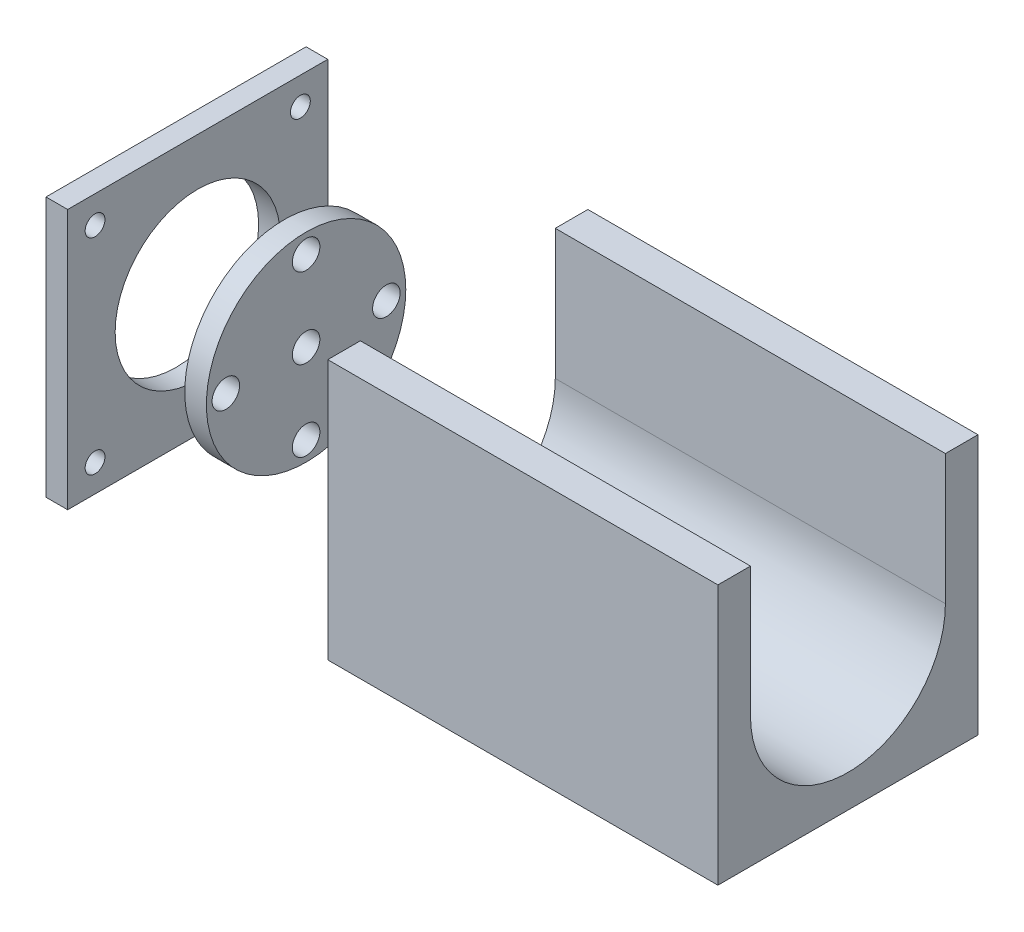
ISO-10303-21;
HEADER;
FILE_DESCRIPTION(('STEP AP214'),'2;1');
FILE_NAME('part.step','',(''),(''),'','','');
FILE_SCHEMA(('AUTOMOTIVE_DESIGN { 1 0 10303 214 1 1 1 1 }'));
ENDSEC;
DATA;
#1=APPLICATION_CONTEXT('core data for automotive mechanical design processes');
#2=APPLICATION_PROTOCOL_DEFINITION('international standard','automotive_design',2000,#1);
#3=PRODUCT_CONTEXT('',#1,'mechanical');
#4=PRODUCT('Part','Part','',(#3));
#5=PRODUCT_RELATED_PRODUCT_CATEGORY('part','',(#4));
#6=PRODUCT_DEFINITION_FORMATION('','',#4);
#7=PRODUCT_DEFINITION_CONTEXT('part definition',#1,'design');
#8=PRODUCT_DEFINITION('design','',#6,#7);
#9=PRODUCT_DEFINITION_SHAPE('','',#8);
#10=(LENGTH_UNIT() NAMED_UNIT(*) SI_UNIT(.MILLI.,.METRE.));
#11=(NAMED_UNIT(*) PLANE_ANGLE_UNIT() SI_UNIT($,.RADIAN.));
#12=(NAMED_UNIT(*) SI_UNIT($,.STERADIAN.) SOLID_ANGLE_UNIT());
#13=UNCERTAINTY_MEASURE_WITH_UNIT(LENGTH_MEASURE(1.E-05),#10,'distance_accuracy_value','');
#14=(GEOMETRIC_REPRESENTATION_CONTEXT(3) GLOBAL_UNCERTAINTY_ASSIGNED_CONTEXT((#13)) GLOBAL_UNIT_ASSIGNED_CONTEXT((#10,
#11,#12)) REPRESENTATION_CONTEXT('',''));
#15=CARTESIAN_POINT('',(0.,0.,0.));
#16=DIRECTION('',(0.,0.,1.));
#17=DIRECTION('',(1.,0.,0.));
#18=AXIS2_PLACEMENT_3D('',#15,#16,#17);
#19=CARTESIAN_POINT('',(155.,0.,0.));
#20=DIRECTION('',(-1.,0.,0.));
#21=DIRECTION('',(0.,0.,1.));
#22=AXIS2_PLACEMENT_3D('',#19,#20,#21);
#23=CYLINDRICAL_SURFACE('',#22,22.48125);
#24=CARTESIAN_POINT('',(65.,0.,0.));
#25=DIRECTION('',(-1.,0.,0.));
#26=DIRECTION('',(0.,0.,-1.));
#27=AXIS2_PLACEMENT_3D('',#24,#25,#26);
#28=CIRCLE('',#27,22.48125);
#29=CARTESIAN_POINT('',(65.,0.,-22.48125));
#30=VERTEX_POINT('',#29);
#31=CARTESIAN_POINT('',(65.,0.,22.48125));
#32=VERTEX_POINT('',#31);
#33=EDGE_CURVE('E140',#30,#32,#28,.T.);
#34=ORIENTED_EDGE('',*,*,#33,.T.);
#35=DIRECTION('',(-1.,0.,0.));
#36=VECTOR('',#35,1.);
#37=CARTESIAN_POINT('',(155.,0.,22.48125));
#38=LINE('',#37,#36);
#39=CARTESIAN_POINT('',(155.,0.,22.48125));
#40=VERTEX_POINT('',#39);
#41=EDGE_CURVE('E12',#40,#32,#38,.T.);
#42=ORIENTED_EDGE('',*,*,#41,.F.);
#43=CARTESIAN_POINT('',(155.,0.,0.));
#44=DIRECTION('',(-1.,0.,0.));
#45=DIRECTION('',(0.,0.,-1.));
#46=AXIS2_PLACEMENT_3D('',#43,#44,#45);
#47=CIRCLE('',#46,22.48125);
#48=CARTESIAN_POINT('',(155.,0.,-22.48125));
#49=VERTEX_POINT('',#48);
#50=EDGE_CURVE('E154',#49,#40,#47,.T.);
#51=ORIENTED_EDGE('',*,*,#50,.F.);
#52=DIRECTION('',(-1.,0.,0.));
#53=VECTOR('',#52,1.);
#54=CARTESIAN_POINT('',(155.,0.,-22.48125));
#55=LINE('',#54,#53);
#56=EDGE_CURVE('E136',#49,#30,#55,.T.);
#57=ORIENTED_EDGE('',*,*,#56,.T.);
#58=EDGE_LOOP('',(#34,#42,#51,#57));
#59=FACE_BOUND('',#58,.T.);
#60=ADVANCED_FACE('F44',(#59),#23,.F.);
#61=CARTESIAN_POINT('',(155.,0.,22.48125));
#62=DIRECTION('',(0.,0.,1.));
#63=DIRECTION('',(1.,0.,0.));
#64=AXIS2_PLACEMENT_3D('',#61,#62,#63);
#65=PLANE('',#64);
#66=DIRECTION('',(0.,1.,0.));
#67=VECTOR('',#66,1.);
#68=CARTESIAN_POINT('',(65.,0.,22.48125));
#69=LINE('',#68,#67);
#70=CARTESIAN_POINT('',(65.,30.,22.48125));
#71=VERTEX_POINT('',#70);
#72=EDGE_CURVE('E143',#32,#71,#69,.T.);
#73=ORIENTED_EDGE('',*,*,#72,.T.);
#74=DIRECTION('',(-1.,0.,0.));
#75=VECTOR('',#74,1.);
#76=CARTESIAN_POINT('',(155.,30.,22.48125));
#77=LINE('',#76,#75);
#78=CARTESIAN_POINT('',(155.,30.,22.48125));
#79=VERTEX_POINT('',#78);
#80=EDGE_CURVE('E52',#79,#71,#77,.T.);
#81=ORIENTED_EDGE('',*,*,#80,.F.);
#82=DIRECTION('',(0.,1.,0.));
#83=VECTOR('',#82,1.);
#84=CARTESIAN_POINT('',(155.,0.,22.48125));
#85=LINE('',#84,#83);
#86=EDGE_CURVE('E103',#40,#79,#85,.T.);
#87=ORIENTED_EDGE('',*,*,#86,.F.);
#88=ORIENTED_EDGE('',*,*,#41,.T.);
#89=EDGE_LOOP('',(#73,#81,#87,#88));
#90=FACE_BOUND('',#89,.T.);
#91=ADVANCED_FACE('F189',(#90),#65,.F.);
#92=CARTESIAN_POINT('',(155.,30.,30.));
#93=DIRECTION('',(0.,-1.,0.));
#94=DIRECTION('',(0.,0.,-1.));
#95=AXIS2_PLACEMENT_3D('',#92,#93,#94);
#96=PLANE('',#95);
#97=DIRECTION('',(0.,0.,1.));
#98=VECTOR('',#97,1.);
#99=CARTESIAN_POINT('',(65.,30.,30.));
#100=LINE('',#99,#98);
#101=CARTESIAN_POINT('',(65.,30.,30.));
#102=VERTEX_POINT('',#101);
#103=EDGE_CURVE('E145',#71,#102,#100,.T.);
#104=ORIENTED_EDGE('',*,*,#103,.T.);
#105=DIRECTION('',(-1.,0.,0.));
#106=VECTOR('',#105,1.);
#107=CARTESIAN_POINT('',(155.,30.,30.));
#108=LINE('',#107,#106);
#109=CARTESIAN_POINT('',(155.,30.,30.));
#110=VERTEX_POINT('',#109);
#111=EDGE_CURVE('E161',#110,#102,#108,.T.);
#112=ORIENTED_EDGE('',*,*,#111,.F.);
#113=DIRECTION('',(0.,0.,1.));
#114=VECTOR('',#113,1.);
#115=CARTESIAN_POINT('',(155.,30.,30.));
#116=LINE('',#115,#114);
#117=EDGE_CURVE('E169',#79,#110,#116,.T.);
#118=ORIENTED_EDGE('',*,*,#117,.F.);
#119=ORIENTED_EDGE('',*,*,#80,.T.);
#120=EDGE_LOOP('',(#104,#112,#118,#119));
#121=FACE_BOUND('',#120,.T.);
#122=ADVANCED_FACE('F167',(#121),#96,.F.);
#123=CARTESIAN_POINT('',(155.,30.,30.));
#124=DIRECTION('',(0.,0.,-1.));
#125=DIRECTION('',(-1.,0.,0.));
#126=AXIS2_PLACEMENT_3D('',#123,#124,#125);
#127=PLANE('',#126);
#128=DIRECTION('',(0.,-1.,0.));
#129=VECTOR('',#128,1.);
#130=CARTESIAN_POINT('',(65.,30.,30.));
#131=LINE('',#130,#129);
#132=CARTESIAN_POINT('',(65.,-30.,30.));
#133=VERTEX_POINT('',#132);
#134=EDGE_CURVE('E147',#102,#133,#131,.T.);
#135=ORIENTED_EDGE('',*,*,#134,.T.);
#136=DIRECTION('',(-1.,0.,0.));
#137=VECTOR('',#136,1.);
#138=CARTESIAN_POINT('',(155.,-30.,30.));
#139=LINE('',#138,#137);
#140=CARTESIAN_POINT('',(155.,-30.,30.));
#141=VERTEX_POINT('',#140);
#142=EDGE_CURVE('E158',#141,#133,#139,.T.);
#143=ORIENTED_EDGE('',*,*,#142,.F.);
#144=DIRECTION('',(0.,-1.,0.));
#145=VECTOR('',#144,1.);
#146=CARTESIAN_POINT('',(155.,30.,30.));
#147=LINE('',#146,#145);
#148=EDGE_CURVE('E181',#110,#141,#147,.T.);
#149=ORIENTED_EDGE('',*,*,#148,.F.);
#150=ORIENTED_EDGE('',*,*,#111,.T.);
#151=EDGE_LOOP('',(#135,#143,#149,#150));
#152=FACE_BOUND('',#151,.T.);
#153=ADVANCED_FACE('F177',(#152),#127,.F.);
#154=CARTESIAN_POINT('',(155.,-30.,30.));
#155=DIRECTION('',(0.,1.,0.));
#156=DIRECTION('',(0.,0.,1.));
#157=AXIS2_PLACEMENT_3D('',#154,#155,#156);
#158=PLANE('',#157);
#159=DIRECTION('',(0.,0.,-1.));
#160=VECTOR('',#159,1.);
#161=CARTESIAN_POINT('',(65.,-30.,30.));
#162=LINE('',#161,#160);
#163=CARTESIAN_POINT('',(65.,-30.,-30.));
#164=VERTEX_POINT('',#163);
#165=EDGE_CURVE('E149',#133,#164,#162,.T.);
#166=ORIENTED_EDGE('',*,*,#165,.T.);
#167=DIRECTION('',(-1.,0.,0.));
#168=VECTOR('',#167,1.);
#169=CARTESIAN_POINT('',(155.,-30.,-30.));
#170=LINE('',#169,#168);
#171=CARTESIAN_POINT('',(155.,-30.,-30.));
#172=VERTEX_POINT('',#171);
#173=EDGE_CURVE('E131',#172,#164,#170,.T.);
#174=ORIENTED_EDGE('',*,*,#173,.F.);
#175=DIRECTION('',(0.,0.,-1.));
#176=VECTOR('',#175,1.);
#177=CARTESIAN_POINT('',(155.,-30.,30.));
#178=LINE('',#177,#176);
#179=EDGE_CURVE('E122',#141,#172,#178,.T.);
#180=ORIENTED_EDGE('',*,*,#179,.F.);
#181=ORIENTED_EDGE('',*,*,#142,.T.);
#182=EDGE_LOOP('',(#166,#174,#180,#181));
#183=FACE_BOUND('',#182,.T.);
#184=ADVANCED_FACE('F180',(#183),#158,.F.);
#185=CARTESIAN_POINT('',(155.,-30.,-30.));
#186=DIRECTION('',(0.,0.,1.));
#187=DIRECTION('',(1.,0.,0.));
#188=AXIS2_PLACEMENT_3D('',#185,#186,#187);
#189=PLANE('',#188);
#190=DIRECTION('',(0.,1.,0.));
#191=VECTOR('',#190,1.);
#192=CARTESIAN_POINT('',(65.,-30.,-30.));
#193=LINE('',#192,#191);
#194=CARTESIAN_POINT('',(65.,30.,-30.));
#195=VERTEX_POINT('',#194);
#196=EDGE_CURVE('E130',#164,#195,#193,.T.);
#197=ORIENTED_EDGE('',*,*,#196,.T.);
#198=DIRECTION('',(-1.,0.,0.));
#199=VECTOR('',#198,1.);
#200=CARTESIAN_POINT('',(155.,30.,-30.));
#201=LINE('',#200,#199);
#202=CARTESIAN_POINT('',(155.,30.,-30.));
#203=VERTEX_POINT('',#202);
#204=EDGE_CURVE('E127',#203,#195,#201,.T.);
#205=ORIENTED_EDGE('',*,*,#204,.F.);
#206=DIRECTION('',(0.,1.,0.));
#207=VECTOR('',#206,1.);
#208=CARTESIAN_POINT('',(155.,-30.,-30.));
#209=LINE('',#208,#207);
#210=EDGE_CURVE('E116',#172,#203,#209,.T.);
#211=ORIENTED_EDGE('',*,*,#210,.F.);
#212=ORIENTED_EDGE('',*,*,#173,.T.);
#213=EDGE_LOOP('',(#197,#205,#211,#212));
#214=FACE_BOUND('',#213,.T.);
#215=ADVANCED_FACE('F128',(#214),#189,.F.);
#216=CARTESIAN_POINT('',(155.,30.,-22.48125));
#217=DIRECTION('',(0.,-1.,0.));
#218=DIRECTION('',(0.,0.,-1.));
#219=AXIS2_PLACEMENT_3D('',#216,#217,#218);
#220=PLANE('',#219);
#221=DIRECTION('',(0.,0.,1.));
#222=VECTOR('',#221,1.);
#223=CARTESIAN_POINT('',(65.,30.,-22.48125));
#224=LINE('',#223,#222);
#225=CARTESIAN_POINT('',(65.,30.,-22.48125));
#226=VERTEX_POINT('',#225);
#227=EDGE_CURVE('E89',#195,#226,#224,.T.);
#228=ORIENTED_EDGE('',*,*,#227,.T.);
#229=DIRECTION('',(-1.,0.,0.));
#230=VECTOR('',#229,1.);
#231=CARTESIAN_POINT('',(155.,30.,-22.48125));
#232=LINE('',#231,#230);
#233=CARTESIAN_POINT('',(155.,30.,-22.48125));
#234=VERTEX_POINT('',#233);
#235=EDGE_CURVE('E132',#234,#226,#232,.T.);
#236=ORIENTED_EDGE('',*,*,#235,.F.);
#237=DIRECTION('',(0.,0.,1.));
#238=VECTOR('',#237,1.);
#239=CARTESIAN_POINT('',(155.,30.,-22.48125));
#240=LINE('',#239,#238);
#241=EDGE_CURVE('E120',#203,#234,#240,.T.);
#242=ORIENTED_EDGE('',*,*,#241,.F.);
#243=ORIENTED_EDGE('',*,*,#204,.T.);
#244=EDGE_LOOP('',(#228,#236,#242,#243));
#245=FACE_BOUND('',#244,.T.);
#246=ADVANCED_FACE('F134',(#245),#220,.F.);
#247=CARTESIAN_POINT('',(155.,0.,-22.48125));
#248=DIRECTION('',(0.,0.,-1.));
#249=DIRECTION('',(-1.,0.,0.));
#250=AXIS2_PLACEMENT_3D('',#247,#248,#249);
#251=PLANE('',#250);
#252=DIRECTION('',(0.,-1.,0.));
#253=VECTOR('',#252,1.);
#254=CARTESIAN_POINT('',(65.,0.,-22.48125));
#255=LINE('',#254,#253);
#256=EDGE_CURVE('E95',#226,#30,#255,.T.);
#257=ORIENTED_EDGE('',*,*,#256,.T.);
#258=ORIENTED_EDGE('',*,*,#56,.F.);
#259=DIRECTION('',(0.,-1.,0.));
#260=VECTOR('',#259,1.);
#261=CARTESIAN_POINT('',(155.,0.,-22.48125));
#262=LINE('',#261,#260);
#263=EDGE_CURVE('E60',#234,#49,#262,.T.);
#264=ORIENTED_EDGE('',*,*,#263,.F.);
#265=ORIENTED_EDGE('',*,*,#235,.T.);
#266=EDGE_LOOP('',(#257,#258,#264,#265));
#267=FACE_BOUND('',#266,.T.);
#268=ADVANCED_FACE('F205',(#267),#251,.F.);
#269=CARTESIAN_POINT('',(155.,0.,0.));
#270=DIRECTION('',(1.,0.,0.));
#271=DIRECTION('',(0.,0.,-1.));
#272=AXIS2_PLACEMENT_3D('',#269,#270,#271);
#273=PLANE('',#272);
#274=ORIENTED_EDGE('',*,*,#50,.T.);
#275=ORIENTED_EDGE('',*,*,#86,.T.);
#276=ORIENTED_EDGE('',*,*,#117,.T.);
#277=ORIENTED_EDGE('',*,*,#148,.T.);
#278=ORIENTED_EDGE('',*,*,#179,.T.);
#279=ORIENTED_EDGE('',*,*,#210,.T.);
#280=ORIENTED_EDGE('',*,*,#241,.T.);
#281=ORIENTED_EDGE('',*,*,#263,.T.);
#282=EDGE_LOOP('',(#274,#275,#276,#277,#278,#279,#280,#281));
#283=FACE_BOUND('',#282,.T.);
#284=ADVANCED_FACE('F118',(#283),#273,.T.);
#285=CARTESIAN_POINT('',(65.,0.,0.));
#286=DIRECTION('',(1.,0.,0.));
#287=DIRECTION('',(0.,0.,-1.));
#288=AXIS2_PLACEMENT_3D('',#285,#286,#287);
#289=PLANE('',#288);
#290=ORIENTED_EDGE('',*,*,#33,.F.);
#291=ORIENTED_EDGE('',*,*,#256,.F.);
#292=ORIENTED_EDGE('',*,*,#227,.F.);
#293=ORIENTED_EDGE('',*,*,#196,.F.);
#294=ORIENTED_EDGE('',*,*,#165,.F.);
#295=ORIENTED_EDGE('',*,*,#134,.F.);
#296=ORIENTED_EDGE('',*,*,#103,.F.);
#297=ORIENTED_EDGE('',*,*,#72,.F.);
#298=EDGE_LOOP('',(#290,#291,#292,#293,#294,#295,#296,#297));
#299=FACE_BOUND('',#298,.T.);
#300=ADVANCED_FACE('F173',(#299),#289,.F.);
#301=CLOSED_SHELL('',(#60,#91,#122,#153,#184,#215,#246,#268,#284,#300));
#302=MANIFOLD_SOLID_BREP('B2',#301);
#303=CARTESIAN_POINT('',(30.,0.,0.));
#304=DIRECTION('',(1.,0.,0.));
#305=DIRECTION('',(0.,0.,-1.));
#306=AXIS2_PLACEMENT_3D('',#303,#304,#305);
#307=PLANE('',#306);
#308=CARTESIAN_POINT('',(30.,-18.5125,0.));
#309=DIRECTION('',(1.,0.,0.));
#310=DIRECTION('',(0.,0.,-1.));
#311=AXIS2_PLACEMENT_3D('',#308,#309,#310);
#312=CIRCLE('',#311,3.175);
#313=CARTESIAN_POINT('',(30.,-18.5125,-3.175));
#314=VERTEX_POINT('',#313);
#315=EDGE_CURVE('E309',#314,#314,#312,.T.);
#316=ORIENTED_EDGE('',*,*,#315,.F.);
#317=EDGE_LOOP('',(#316));
#318=FACE_BOUND('',#317,.T.);
#319=CARTESIAN_POINT('',(30.,18.5125,0.));
#320=DIRECTION('',(1.,0.,0.));
#321=DIRECTION('',(0.,0.,-1.));
#322=AXIS2_PLACEMENT_3D('',#319,#320,#321);
#323=CIRCLE('',#322,3.175);
#324=CARTESIAN_POINT('',(30.,18.5125,-3.175));
#325=VERTEX_POINT('',#324);
#326=EDGE_CURVE('E297',#325,#325,#323,.T.);
#327=ORIENTED_EDGE('',*,*,#326,.F.);
#328=EDGE_LOOP('',(#327));
#329=FACE_BOUND('',#328,.T.);
#330=CARTESIAN_POINT('',(30.,0.,0.));
#331=DIRECTION('',(1.,0.,0.));
#332=DIRECTION('',(0.,0.,-1.));
#333=AXIS2_PLACEMENT_3D('',#330,#331,#332);
#334=CIRCLE('',#333,23.);
#335=CARTESIAN_POINT('',(30.,0.,-23.));
#336=VERTEX_POINT('',#335);
#337=EDGE_CURVE('E43',#336,#336,#334,.T.);
#338=ORIENTED_EDGE('',*,*,#337,.T.);
#339=EDGE_LOOP('',(#338));
#340=FACE_BOUND('',#339,.T.);
#341=CARTESIAN_POINT('',(30.,0.,0.));
#342=DIRECTION('',(1.,0.,0.));
#343=DIRECTION('',(0.,0.,-1.));
#344=AXIS2_PLACEMENT_3D('',#341,#342,#343);
#345=CIRCLE('',#344,3.175);
#346=CARTESIAN_POINT('',(30.,0.,-3.175));
#347=VERTEX_POINT('',#346);
#348=EDGE_CURVE('E292',#347,#347,#345,.T.);
#349=ORIENTED_EDGE('',*,*,#348,.F.);
#350=EDGE_LOOP('',(#349));
#351=FACE_BOUND('',#350,.T.);
#352=CARTESIAN_POINT('',(30.,0.,18.5125));
#353=DIRECTION('',(1.,0.,0.));
#354=DIRECTION('',(0.,0.,-1.));
#355=AXIS2_PLACEMENT_3D('',#352,#353,#354);
#356=CIRCLE('',#355,3.175);
#357=CARTESIAN_POINT('',(30.,0.,15.3375));
#358=VERTEX_POINT('',#357);
#359=EDGE_CURVE('E303',#358,#358,#356,.T.);
#360=ORIENTED_EDGE('',*,*,#359,.F.);
#361=EDGE_LOOP('',(#360));
#362=FACE_BOUND('',#361,.T.);
#363=CARTESIAN_POINT('',(30.,0.,-18.5125));
#364=DIRECTION('',(1.,0.,0.));
#365=DIRECTION('',(0.,0.,-1.));
#366=AXIS2_PLACEMENT_3D('',#363,#364,#365);
#367=CIRCLE('',#366,3.175);
#368=CARTESIAN_POINT('',(30.,0.,-21.6875));
#369=VERTEX_POINT('',#368);
#370=EDGE_CURVE('E315',#369,#369,#367,.T.);
#371=ORIENTED_EDGE('',*,*,#370,.F.);
#372=EDGE_LOOP('',(#371));
#373=FACE_BOUND('',#372,.T.);
#374=ADVANCED_FACE('F281',(#318,#329,#340,#351,#362,#373),#307,.T.);
#375=CARTESIAN_POINT('',(25.,0.,0.));
#376=DIRECTION('',(1.,0.,0.));
#377=DIRECTION('',(0.,0.,-1.));
#378=AXIS2_PLACEMENT_3D('',#375,#376,#377);
#379=PLANE('',#378);
#380=CARTESIAN_POINT('',(25.,-18.5125,0.));
#381=DIRECTION('',(1.,0.,0.));
#382=DIRECTION('',(0.,0.,-1.));
#383=AXIS2_PLACEMENT_3D('',#380,#381,#382);
#384=CIRCLE('',#383,3.175);
#385=CARTESIAN_POINT('',(25.,-18.5125,-3.175));
#386=VERTEX_POINT('',#385);
#387=EDGE_CURVE('E312',#386,#386,#384,.T.);
#388=ORIENTED_EDGE('',*,*,#387,.T.);
#389=EDGE_LOOP('',(#388));
#390=FACE_BOUND('',#389,.T.);
#391=CARTESIAN_POINT('',(25.,18.5125,0.));
#392=DIRECTION('',(1.,0.,0.));
#393=DIRECTION('',(0.,0.,-1.));
#394=AXIS2_PLACEMENT_3D('',#391,#392,#393);
#395=CIRCLE('',#394,3.175);
#396=CARTESIAN_POINT('',(25.,18.5125,-3.175));
#397=VERTEX_POINT('',#396);
#398=EDGE_CURVE('E300',#397,#397,#395,.T.);
#399=ORIENTED_EDGE('',*,*,#398,.T.);
#400=EDGE_LOOP('',(#399));
#401=FACE_BOUND('',#400,.T.);
#402=CARTESIAN_POINT('',(25.,0.,0.));
#403=DIRECTION('',(1.,0.,0.));
#404=DIRECTION('',(0.,0.,-1.));
#405=AXIS2_PLACEMENT_3D('',#402,#403,#404);
#406=CIRCLE('',#405,23.);
#407=CARTESIAN_POINT('',(25.,0.,-23.));
#408=VERTEX_POINT('',#407);
#409=EDGE_CURVE('E285',#408,#408,#406,.T.);
#410=ORIENTED_EDGE('',*,*,#409,.F.);
#411=EDGE_LOOP('',(#410));
#412=FACE_BOUND('',#411,.T.);
#413=CARTESIAN_POINT('',(25.,0.,0.));
#414=DIRECTION('',(1.,0.,0.));
#415=DIRECTION('',(0.,0.,-1.));
#416=AXIS2_PLACEMENT_3D('',#413,#414,#415);
#417=CIRCLE('',#416,3.175);
#418=CARTESIAN_POINT('',(25.,0.,-3.175));
#419=VERTEX_POINT('',#418);
#420=EDGE_CURVE('E294',#419,#419,#417,.T.);
#421=ORIENTED_EDGE('',*,*,#420,.T.);
#422=EDGE_LOOP('',(#421));
#423=FACE_BOUND('',#422,.T.);
#424=CARTESIAN_POINT('',(25.,0.,18.5125));
#425=DIRECTION('',(1.,0.,0.));
#426=DIRECTION('',(0.,0.,-1.));
#427=AXIS2_PLACEMENT_3D('',#424,#425,#426);
#428=CIRCLE('',#427,3.175);
#429=CARTESIAN_POINT('',(25.,0.,15.3375));
#430=VERTEX_POINT('',#429);
#431=EDGE_CURVE('E306',#430,#430,#428,.T.);
#432=ORIENTED_EDGE('',*,*,#431,.T.);
#433=EDGE_LOOP('',(#432));
#434=FACE_BOUND('',#433,.T.);
#435=CARTESIAN_POINT('',(25.,0.,-18.5125));
#436=DIRECTION('',(1.,0.,0.));
#437=DIRECTION('',(0.,0.,-1.));
#438=AXIS2_PLACEMENT_3D('',#435,#436,#437);
#439=CIRCLE('',#438,3.175);
#440=CARTESIAN_POINT('',(25.,0.,-21.6875));
#441=VERTEX_POINT('',#440);
#442=EDGE_CURVE('E318',#441,#441,#439,.T.);
#443=ORIENTED_EDGE('',*,*,#442,.T.);
#444=EDGE_LOOP('',(#443));
#445=FACE_BOUND('',#444,.T.);
#446=ADVANCED_FACE('F328',(#390,#401,#412,#423,#434,#445),#379,.F.);
#447=CARTESIAN_POINT('',(30.,0.,0.));
#448=DIRECTION('',(-1.,0.,0.));
#449=DIRECTION('',(0.,0.,1.));
#450=AXIS2_PLACEMENT_3D('',#447,#448,#449);
#451=CYLINDRICAL_SURFACE('',#450,23.);
#452=ORIENTED_EDGE('',*,*,#337,.F.);
#453=EDGE_LOOP('',(#452));
#454=FACE_BOUND('',#453,.T.);
#455=ORIENTED_EDGE('',*,*,#409,.T.);
#456=EDGE_LOOP('',(#455));
#457=FACE_BOUND('',#456,.T.);
#458=ADVANCED_FACE('F283',(#454,#457),#451,.T.);
#459=CARTESIAN_POINT('',(30.,0.,0.));
#460=DIRECTION('',(-1.,0.,0.));
#461=DIRECTION('',(0.,0.,1.));
#462=AXIS2_PLACEMENT_3D('',#459,#460,#461);
#463=CYLINDRICAL_SURFACE('',#462,3.175);
#464=ORIENTED_EDGE('',*,*,#348,.T.);
#465=EDGE_LOOP('',(#464));
#466=FACE_BOUND('',#465,.T.);
#467=ORIENTED_EDGE('',*,*,#420,.F.);
#468=EDGE_LOOP('',(#467));
#469=FACE_BOUND('',#468,.T.);
#470=ADVANCED_FACE('F338',(#466,#469),#463,.F.);
#471=CARTESIAN_POINT('',(30.,18.5125,0.));
#472=DIRECTION('',(-1.,0.,0.));
#473=DIRECTION('',(0.,0.,1.));
#474=AXIS2_PLACEMENT_3D('',#471,#472,#473);
#475=CYLINDRICAL_SURFACE('',#474,3.175);
#476=ORIENTED_EDGE('',*,*,#326,.T.);
#477=EDGE_LOOP('',(#476));
#478=FACE_BOUND('',#477,.T.);
#479=ORIENTED_EDGE('',*,*,#398,.F.);
#480=EDGE_LOOP('',(#479));
#481=FACE_BOUND('',#480,.T.);
#482=ADVANCED_FACE('F341',(#478,#481),#475,.F.);
#483=CARTESIAN_POINT('',(30.,0.,18.5125));
#484=DIRECTION('',(-1.,0.,0.));
#485=DIRECTION('',(0.,0.,1.));
#486=AXIS2_PLACEMENT_3D('',#483,#484,#485);
#487=CYLINDRICAL_SURFACE('',#486,3.175);
#488=ORIENTED_EDGE('',*,*,#359,.T.);
#489=EDGE_LOOP('',(#488));
#490=FACE_BOUND('',#489,.T.);
#491=ORIENTED_EDGE('',*,*,#431,.F.);
#492=EDGE_LOOP('',(#491));
#493=FACE_BOUND('',#492,.T.);
#494=ADVANCED_FACE('F345',(#490,#493),#487,.F.);
#495=CARTESIAN_POINT('',(30.,-18.5125,0.));
#496=DIRECTION('',(-1.,0.,0.));
#497=DIRECTION('',(0.,0.,1.));
#498=AXIS2_PLACEMENT_3D('',#495,#496,#497);
#499=CYLINDRICAL_SURFACE('',#498,3.175);
#500=ORIENTED_EDGE('',*,*,#315,.T.);
#501=EDGE_LOOP('',(#500));
#502=FACE_BOUND('',#501,.T.);
#503=ORIENTED_EDGE('',*,*,#387,.F.);
#504=EDGE_LOOP('',(#503));
#505=FACE_BOUND('',#504,.T.);
#506=ADVANCED_FACE('F349',(#502,#505),#499,.F.);
#507=CARTESIAN_POINT('',(30.,0.,-18.5125));
#508=DIRECTION('',(-1.,0.,0.));
#509=DIRECTION('',(0.,0.,1.));
#510=AXIS2_PLACEMENT_3D('',#507,#508,#509);
#511=CYLINDRICAL_SURFACE('',#510,3.175);
#512=ORIENTED_EDGE('',*,*,#370,.T.);
#513=EDGE_LOOP('',(#512));
#514=FACE_BOUND('',#513,.T.);
#515=ORIENTED_EDGE('',*,*,#442,.F.);
#516=EDGE_LOOP('',(#515));
#517=FACE_BOUND('',#516,.T.);
#518=ADVANCED_FACE('F324',(#514,#517),#511,.F.);
#519=CLOSED_SHELL('',(#374,#446,#458,#470,#482,#494,#506,#518));
#520=MANIFOLD_SOLID_BREP('B6',#519);
#521=CARTESIAN_POINT('',(5.,-30.,-30.));
#522=DIRECTION('',(1.,0.,0.));
#523=DIRECTION('',(0.,0.,-1.));
#524=AXIS2_PLACEMENT_3D('',#521,#522,#523);
#525=PLANE('',#524);
#526=CARTESIAN_POINT('',(5.,-23.6855,-23.6855));
#527=DIRECTION('',(1.,0.,0.));
#528=DIRECTION('',(0.,0.,-1.));
#529=AXIS2_PLACEMENT_3D('',#526,#527,#528);
#530=CIRCLE('',#529,2.286);
#531=CARTESIAN_POINT('',(5.,-23.6855,-25.9715));
#532=VERTEX_POINT('',#531);
#533=EDGE_CURVE('E521',#532,#532,#530,.T.);
#534=ORIENTED_EDGE('',*,*,#533,.F.);
#535=EDGE_LOOP('',(#534));
#536=FACE_BOUND('',#535,.T.);
#537=CARTESIAN_POINT('',(5.,23.6855,-23.6855));
#538=DIRECTION('',(1.,0.,0.));
#539=DIRECTION('',(0.,0.,-1.));
#540=AXIS2_PLACEMENT_3D('',#537,#538,#539);
#541=CIRCLE('',#540,2.286);
#542=CARTESIAN_POINT('',(5.,23.6855,-25.9715));
#543=VERTEX_POINT('',#542);
#544=EDGE_CURVE('E509',#543,#543,#541,.T.);
#545=ORIENTED_EDGE('',*,*,#544,.F.);
#546=EDGE_LOOP('',(#545));
#547=FACE_BOUND('',#546,.T.);
#548=DIRECTION('',(0.,1.,0.));
#549=VECTOR('',#548,1.);
#550=CARTESIAN_POINT('',(5.,30.,-30.));
#551=LINE('',#550,#549);
#552=CARTESIAN_POINT('',(5.,-30.,-30.));
#553=VERTEX_POINT('',#552);
#554=CARTESIAN_POINT('',(5.,30.,-30.));
#555=VERTEX_POINT('',#554);
#556=EDGE_CURVE('E479',#553,#555,#551,.T.);
#557=ORIENTED_EDGE('',*,*,#556,.T.);
#558=DIRECTION('',(0.,0.,1.));
#559=VECTOR('',#558,1.);
#560=CARTESIAN_POINT('',(5.,30.,30.));
#561=LINE('',#560,#559);
#562=CARTESIAN_POINT('',(5.,30.,30.));
#563=VERTEX_POINT('',#562);
#564=EDGE_CURVE('E474',#555,#563,#561,.T.);
#565=ORIENTED_EDGE('',*,*,#564,.T.);
#566=DIRECTION('',(0.,-1.,0.));
#567=VECTOR('',#566,1.);
#568=CARTESIAN_POINT('',(5.,30.,30.));
#569=LINE('',#568,#567);
#570=CARTESIAN_POINT('',(5.,-30.,30.));
#571=VERTEX_POINT('',#570);
#572=EDGE_CURVE('E477',#563,#571,#569,.T.);
#573=ORIENTED_EDGE('',*,*,#572,.T.);
#574=DIRECTION('',(0.,0.,-1.));
#575=VECTOR('',#574,1.);
#576=CARTESIAN_POINT('',(5.,-30.,30.));
#577=LINE('',#576,#575);
#578=EDGE_CURVE('E444',#571,#553,#577,.T.);
#579=ORIENTED_EDGE('',*,*,#578,.T.);
#580=EDGE_LOOP('',(#557,#565,#573,#579));
#581=FACE_BOUND('',#580,.T.);
#582=CARTESIAN_POINT('',(5.,23.6855,23.6855));
#583=DIRECTION('',(1.,0.,0.));
#584=DIRECTION('',(0.,0.,-1.));
#585=AXIS2_PLACEMENT_3D('',#582,#583,#584);
#586=CIRCLE('',#585,2.286);
#587=CARTESIAN_POINT('',(5.,23.6855,21.3995));
#588=VERTEX_POINT('',#587);
#589=EDGE_CURVE('E494',#588,#588,#586,.T.);
#590=ORIENTED_EDGE('',*,*,#589,.F.);
#591=EDGE_LOOP('',(#590));
#592=FACE_BOUND('',#591,.T.);
#593=CARTESIAN_POINT('',(5.,-23.6855,23.6855));
#594=DIRECTION('',(1.,0.,0.));
#595=DIRECTION('',(0.,0.,-1.));
#596=AXIS2_PLACEMENT_3D('',#593,#594,#595);
#597=CIRCLE('',#596,2.286);
#598=CARTESIAN_POINT('',(5.,-23.6855,21.3995));
#599=VERTEX_POINT('',#598);
#600=EDGE_CURVE('E515',#599,#599,#597,.T.);
#601=ORIENTED_EDGE('',*,*,#600,.F.);
#602=EDGE_LOOP('',(#601));
#603=FACE_BOUND('',#602,.T.);
#604=CARTESIAN_POINT('',(5.,0.,0.));
#605=DIRECTION('',(1.,0.,0.));
#606=DIRECTION('',(0.,0.,-1.));
#607=AXIS2_PLACEMENT_3D('',#604,#605,#606);
#608=CIRCLE('',#607,19.05);
#609=CARTESIAN_POINT('',(5.,0.,-19.05));
#610=VERTEX_POINT('',#609);
#611=EDGE_CURVE('E527',#610,#610,#608,.T.);
#612=ORIENTED_EDGE('',*,*,#611,.F.);
#613=EDGE_LOOP('',(#612));
#614=FACE_BOUND('',#613,.T.);
#615=ADVANCED_FACE('F427',(#536,#547,#581,#592,#603,#614),#525,.T.);
#616=CARTESIAN_POINT('',(0.,-30.,-30.));
#617=DIRECTION('',(1.,0.,0.));
#618=DIRECTION('',(0.,0.,-1.));
#619=AXIS2_PLACEMENT_3D('',#616,#617,#618);
#620=PLANE('',#619);
#621=CARTESIAN_POINT('',(0.,-23.6855,-23.6855));
#622=DIRECTION('',(1.,0.,0.));
#623=DIRECTION('',(0.,0.,-1.));
#624=AXIS2_PLACEMENT_3D('',#621,#622,#623);
#625=CIRCLE('',#624,2.286);
#626=CARTESIAN_POINT('',(0.,-23.6855,-25.9715));
#627=VERTEX_POINT('',#626);
#628=EDGE_CURVE('E524',#627,#627,#625,.T.);
#629=ORIENTED_EDGE('',*,*,#628,.T.);
#630=EDGE_LOOP('',(#629));
#631=FACE_BOUND('',#630,.T.);
#632=CARTESIAN_POINT('',(0.,23.6855,-23.6855));
#633=DIRECTION('',(1.,0.,0.));
#634=DIRECTION('',(0.,0.,-1.));
#635=AXIS2_PLACEMENT_3D('',#632,#633,#634);
#636=CIRCLE('',#635,2.286);
#637=CARTESIAN_POINT('',(0.,23.6855,-25.9715));
#638=VERTEX_POINT('',#637);
#639=EDGE_CURVE('E512',#638,#638,#636,.T.);
#640=ORIENTED_EDGE('',*,*,#639,.T.);
#641=EDGE_LOOP('',(#640));
#642=FACE_BOUND('',#641,.T.);
#643=DIRECTION('',(0.,1.,0.));
#644=VECTOR('',#643,1.);
#645=CARTESIAN_POINT('',(0.,30.,-30.));
#646=LINE('',#645,#644);
#647=CARTESIAN_POINT('',(0.,-30.,-30.));
#648=VERTEX_POINT('',#647);
#649=CARTESIAN_POINT('',(0.,30.,-30.));
#650=VERTEX_POINT('',#649);
#651=EDGE_CURVE('E491',#648,#650,#646,.T.);
#652=ORIENTED_EDGE('',*,*,#651,.F.);
#653=DIRECTION('',(0.,0.,-1.));
#654=VECTOR('',#653,1.);
#655=CARTESIAN_POINT('',(0.,-30.,30.));
#656=LINE('',#655,#654);
#657=CARTESIAN_POINT('',(0.,-30.,30.));
#658=VERTEX_POINT('',#657);
#659=EDGE_CURVE('E467',#658,#648,#656,.T.);
#660=ORIENTED_EDGE('',*,*,#659,.F.);
#661=DIRECTION('',(0.,-1.,0.));
#662=VECTOR('',#661,1.);
#663=CARTESIAN_POINT('',(0.,30.,30.));
#664=LINE('',#663,#662);
#665=CARTESIAN_POINT('',(0.,30.,30.));
#666=VERTEX_POINT('',#665);
#667=EDGE_CURVE('E461',#666,#658,#664,.T.);
#668=ORIENTED_EDGE('',*,*,#667,.F.);
#669=DIRECTION('',(0.,0.,1.));
#670=VECTOR('',#669,1.);
#671=CARTESIAN_POINT('',(0.,30.,30.));
#672=LINE('',#671,#670);
#673=EDGE_CURVE('E483',#650,#666,#672,.T.);
#674=ORIENTED_EDGE('',*,*,#673,.F.);
#675=EDGE_LOOP('',(#652,#660,#668,#674));
#676=FACE_BOUND('',#675,.T.);
#677=CARTESIAN_POINT('',(0.,23.6855,23.6855));
#678=DIRECTION('',(1.,0.,0.));
#679=DIRECTION('',(0.,0.,-1.));
#680=AXIS2_PLACEMENT_3D('',#677,#678,#679);
#681=CIRCLE('',#680,2.286);
#682=CARTESIAN_POINT('',(0.,23.6855,21.3995));
#683=VERTEX_POINT('',#682);
#684=EDGE_CURVE('E506',#683,#683,#681,.T.);
#685=ORIENTED_EDGE('',*,*,#684,.T.);
#686=EDGE_LOOP('',(#685));
#687=FACE_BOUND('',#686,.T.);
#688=CARTESIAN_POINT('',(0.,-23.6855,23.6855));
#689=DIRECTION('',(1.,0.,0.));
#690=DIRECTION('',(0.,0.,-1.));
#691=AXIS2_PLACEMENT_3D('',#688,#689,#690);
#692=CIRCLE('',#691,2.286);
#693=CARTESIAN_POINT('',(0.,-23.6855,21.3995));
#694=VERTEX_POINT('',#693);
#695=EDGE_CURVE('E518',#694,#694,#692,.T.);
#696=ORIENTED_EDGE('',*,*,#695,.T.);
#697=EDGE_LOOP('',(#696));
#698=FACE_BOUND('',#697,.T.);
#699=CARTESIAN_POINT('',(0.,0.,0.));
#700=DIRECTION('',(1.,0.,0.));
#701=DIRECTION('',(0.,0.,-1.));
#702=AXIS2_PLACEMENT_3D('',#699,#700,#701);
#703=CIRCLE('',#702,19.05);
#704=CARTESIAN_POINT('',(0.,0.,-19.05));
#705=VERTEX_POINT('',#704);
#706=EDGE_CURVE('E530',#705,#705,#703,.T.);
#707=ORIENTED_EDGE('',*,*,#706,.T.);
#708=EDGE_LOOP('',(#707));
#709=FACE_BOUND('',#708,.T.);
#710=ADVANCED_FACE('F502',(#631,#642,#676,#687,#698,#709),#620,.F.);
#711=CARTESIAN_POINT('',(5.,30.,-30.));
#712=DIRECTION('',(0.,0.,1.));
#713=DIRECTION('',(1.,0.,0.));
#714=AXIS2_PLACEMENT_3D('',#711,#712,#713);
#715=PLANE('',#714);
#716=ORIENTED_EDGE('',*,*,#651,.T.);
#717=DIRECTION('',(-1.,0.,0.));
#718=VECTOR('',#717,1.);
#719=CARTESIAN_POINT('',(5.,30.,-30.));
#720=LINE('',#719,#718);
#721=EDGE_CURVE('E279',#555,#650,#720,.T.);
#722=ORIENTED_EDGE('',*,*,#721,.F.);
#723=ORIENTED_EDGE('',*,*,#556,.F.);
#724=DIRECTION('',(-1.,0.,0.));
#725=VECTOR('',#724,1.);
#726=CARTESIAN_POINT('',(5.,-30.,-30.));
#727=LINE('',#726,#725);
#728=EDGE_CURVE('E487',#553,#648,#727,.T.);
#729=ORIENTED_EDGE('',*,*,#728,.T.);
#730=EDGE_LOOP('',(#716,#722,#723,#729));
#731=FACE_BOUND('',#730,.T.);
#732=ADVANCED_FACE('F429',(#731),#715,.F.);
#733=CARTESIAN_POINT('',(5.,30.,30.));
#734=DIRECTION('',(0.,-1.,0.));
#735=DIRECTION('',(0.,0.,-1.));
#736=AXIS2_PLACEMENT_3D('',#733,#734,#735);
#737=PLANE('',#736);
#738=ORIENTED_EDGE('',*,*,#673,.T.);
#739=DIRECTION('',(-1.,0.,0.));
#740=VECTOR('',#739,1.);
#741=CARTESIAN_POINT('',(5.,30.,30.));
#742=LINE('',#741,#740);
#743=EDGE_CURVE('E436',#563,#666,#742,.T.);
#744=ORIENTED_EDGE('',*,*,#743,.F.);
#745=ORIENTED_EDGE('',*,*,#564,.F.);
#746=ORIENTED_EDGE('',*,*,#721,.T.);
#747=EDGE_LOOP('',(#738,#744,#745,#746));
#748=FACE_BOUND('',#747,.T.);
#749=ADVANCED_FACE('F482',(#748),#737,.F.);
#750=CARTESIAN_POINT('',(5.,30.,30.));
#751=DIRECTION('',(0.,0.,-1.));
#752=DIRECTION('',(0.,1.,0.));
#753=AXIS2_PLACEMENT_3D('',#750,#751,#752);
#754=PLANE('',#753);
#755=ORIENTED_EDGE('',*,*,#667,.T.);
#756=DIRECTION('',(-1.,0.,0.));
#757=VECTOR('',#756,1.);
#758=CARTESIAN_POINT('',(5.,-30.,30.));
#759=LINE('',#758,#757);
#760=EDGE_CURVE('E484',#571,#658,#759,.T.);
#761=ORIENTED_EDGE('',*,*,#760,.F.);
#762=ORIENTED_EDGE('',*,*,#572,.F.);
#763=ORIENTED_EDGE('',*,*,#743,.T.);
#764=EDGE_LOOP('',(#755,#761,#762,#763));
#765=FACE_BOUND('',#764,.T.);
#766=ADVANCED_FACE('F485',(#765),#754,.F.);
#767=CARTESIAN_POINT('',(5.,-30.,30.));
#768=DIRECTION('',(0.,1.,0.));
#769=DIRECTION('',(0.,0.,1.));
#770=AXIS2_PLACEMENT_3D('',#767,#768,#769);
#771=PLANE('',#770);
#772=ORIENTED_EDGE('',*,*,#659,.T.);
#773=ORIENTED_EDGE('',*,*,#728,.F.);
#774=ORIENTED_EDGE('',*,*,#578,.F.);
#775=ORIENTED_EDGE('',*,*,#760,.T.);
#776=EDGE_LOOP('',(#772,#773,#774,#775));
#777=FACE_BOUND('',#776,.T.);
#778=ADVANCED_FACE('F499',(#777),#771,.F.);
#779=CARTESIAN_POINT('',(5.,23.6855,23.6855));
#780=DIRECTION('',(-1.,0.,0.));
#781=DIRECTION('',(0.,0.,1.));
#782=AXIS2_PLACEMENT_3D('',#779,#780,#781);
#783=CYLINDRICAL_SURFACE('',#782,2.286);
#784=ORIENTED_EDGE('',*,*,#589,.T.);
#785=EDGE_LOOP('',(#784));
#786=FACE_BOUND('',#785,.T.);
#787=ORIENTED_EDGE('',*,*,#684,.F.);
#788=EDGE_LOOP('',(#787));
#789=FACE_BOUND('',#788,.T.);
#790=ADVANCED_FACE('F550',(#786,#789),#783,.F.);
#791=CARTESIAN_POINT('',(5.,23.6855,-23.6855));
#792=DIRECTION('',(-1.,0.,0.));
#793=DIRECTION('',(0.,0.,1.));
#794=AXIS2_PLACEMENT_3D('',#791,#792,#793);
#795=CYLINDRICAL_SURFACE('',#794,2.286);
#796=ORIENTED_EDGE('',*,*,#544,.T.);
#797=EDGE_LOOP('',(#796));
#798=FACE_BOUND('',#797,.T.);
#799=ORIENTED_EDGE('',*,*,#639,.F.);
#800=EDGE_LOOP('',(#799));
#801=FACE_BOUND('',#800,.T.);
#802=ADVANCED_FACE('F596',(#798,#801),#795,.F.);
#803=CARTESIAN_POINT('',(5.,-23.6855,23.6855));
#804=DIRECTION('',(-1.,0.,0.));
#805=DIRECTION('',(0.,0.,1.));
#806=AXIS2_PLACEMENT_3D('',#803,#804,#805);
#807=CYLINDRICAL_SURFACE('',#806,2.286);
#808=ORIENTED_EDGE('',*,*,#600,.T.);
#809=EDGE_LOOP('',(#808));
#810=FACE_BOUND('',#809,.T.);
#811=ORIENTED_EDGE('',*,*,#695,.F.);
#812=EDGE_LOOP('',(#811));
#813=FACE_BOUND('',#812,.T.);
#814=ADVANCED_FACE('F604',(#810,#813),#807,.F.);
#815=CARTESIAN_POINT('',(5.,-23.6855,-23.6855));
#816=DIRECTION('',(-1.,0.,0.));
#817=DIRECTION('',(0.,0.,1.));
#818=AXIS2_PLACEMENT_3D('',#815,#816,#817);
#819=CYLINDRICAL_SURFACE('',#818,2.286);
#820=ORIENTED_EDGE('',*,*,#533,.T.);
#821=EDGE_LOOP('',(#820));
#822=FACE_BOUND('',#821,.T.);
#823=ORIENTED_EDGE('',*,*,#628,.F.);
#824=EDGE_LOOP('',(#823));
#825=FACE_BOUND('',#824,.T.);
#826=ADVANCED_FACE('F612',(#822,#825),#819,.F.);
#827=CARTESIAN_POINT('',(5.,0.,0.));
#828=DIRECTION('',(-1.,0.,0.));
#829=DIRECTION('',(0.,0.,1.));
#830=AXIS2_PLACEMENT_3D('',#827,#828,#829);
#831=CYLINDRICAL_SURFACE('',#830,19.05);
#832=ORIENTED_EDGE('',*,*,#611,.T.);
#833=EDGE_LOOP('',(#832));
#834=FACE_BOUND('',#833,.T.);
#835=ORIENTED_EDGE('',*,*,#706,.F.);
#836=EDGE_LOOP('',(#835));
#837=FACE_BOUND('',#836,.T.);
#838=ADVANCED_FACE('F536',(#834,#837),#831,.F.);
#839=CLOSED_SHELL('',(#615,#710,#732,#749,#766,#778,#790,#802,#814,#826,#838));
#840=MANIFOLD_SOLID_BREP('B38_NOT_SHOWN',#839);
#841=ADVANCED_BREP_SHAPE_REPRESENTATION('',(#18,#302,#520,#840),#14);
#842=SHAPE_DEFINITION_REPRESENTATION(#9,#841);
ENDSEC;
END-ISO-10303-21;
